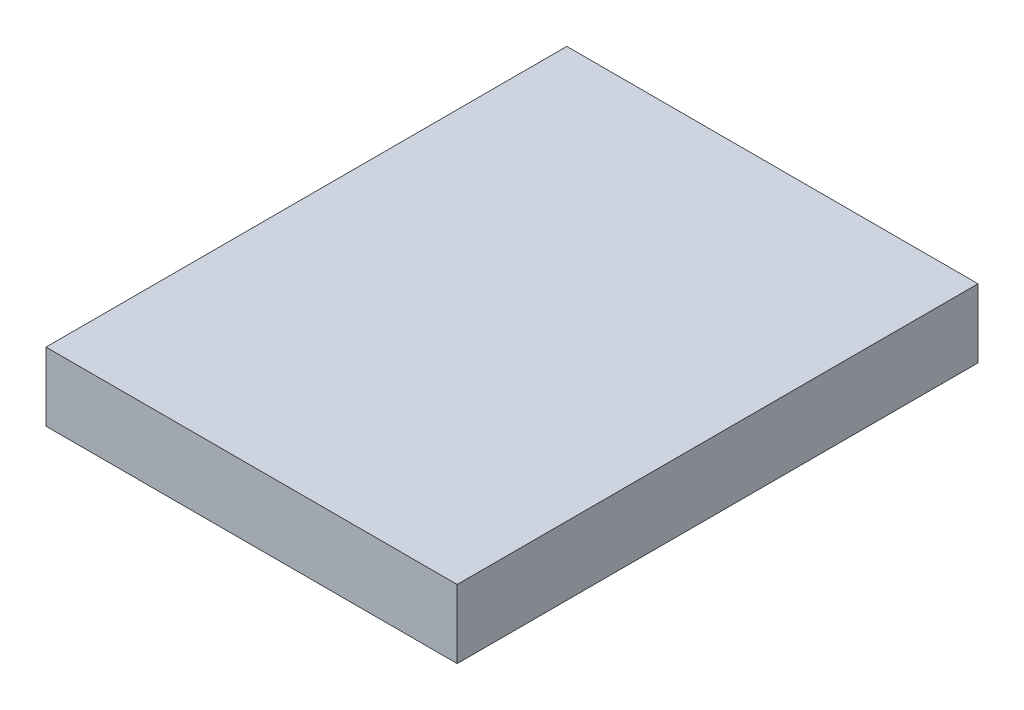
ISO-10303-21;
HEADER;
FILE_DESCRIPTION(('STEP AP214'),'2;1');
FILE_NAME('part.step','',(''),(''),'','','');
FILE_SCHEMA(('AUTOMOTIVE_DESIGN { 1 0 10303 214 1 1 1 1 }'));
ENDSEC;
DATA;
#1=APPLICATION_CONTEXT('core data for automotive mechanical design processes');
#2=APPLICATION_PROTOCOL_DEFINITION('international standard','automotive_design',2000,#1);
#3=PRODUCT_CONTEXT('',#1,'mechanical');
#4=PRODUCT('Part','Part','',(#3));
#5=PRODUCT_RELATED_PRODUCT_CATEGORY('part','',(#4));
#6=PRODUCT_DEFINITION_FORMATION('','',#4);
#7=PRODUCT_DEFINITION_CONTEXT('part definition',#1,'design');
#8=PRODUCT_DEFINITION('design','',#6,#7);
#9=PRODUCT_DEFINITION_SHAPE('','',#8);
#10=(LENGTH_UNIT() NAMED_UNIT(*) SI_UNIT(.MILLI.,.METRE.));
#11=(NAMED_UNIT(*) PLANE_ANGLE_UNIT() SI_UNIT($,.RADIAN.));
#12=(NAMED_UNIT(*) SI_UNIT($,.STERADIAN.) SOLID_ANGLE_UNIT());
#13=UNCERTAINTY_MEASURE_WITH_UNIT(LENGTH_MEASURE(1.E-05),#10,'distance_accuracy_value','');
#14=(GEOMETRIC_REPRESENTATION_CONTEXT(3) GLOBAL_UNCERTAINTY_ASSIGNED_CONTEXT((#13)) GLOBAL_UNIT_ASSIGNED_CONTEXT((#10,
#11,#12)) REPRESENTATION_CONTEXT('',''));
#15=CARTESIAN_POINT('',(0.,0.,0.));
#16=DIRECTION('',(0.,0.,1.));
#17=DIRECTION('',(1.,0.,0.));
#18=AXIS2_PLACEMENT_3D('',#15,#16,#17);
#19=CARTESIAN_POINT('',(-60.,20.,76.));
#20=DIRECTION('',(1.,0.,0.));
#21=DIRECTION('',(0.,0.,-1.));
#22=AXIS2_PLACEMENT_3D('',#19,#20,#21);
#23=PLANE('',#22);
#24=DIRECTION('',(0.,0.,1.));
#25=VECTOR('',#24,1.);
#26=CARTESIAN_POINT('',(-60.,0.,76.));
#27=LINE('',#26,#25);
#28=CARTESIAN_POINT('',(-60.,0.,-76.));
#29=VERTEX_POINT('',#28);
#30=CARTESIAN_POINT('',(-60.,0.,76.));
#31=VERTEX_POINT('',#30);
#32=EDGE_CURVE('E96',#29,#31,#27,.T.);
#33=ORIENTED_EDGE('',*,*,#32,.T.);
#34=DIRECTION('',(0.,-1.,0.));
#35=VECTOR('',#34,1.);
#36=CARTESIAN_POINT('',(-60.,20.,76.));
#37=LINE('',#36,#35);
#38=CARTESIAN_POINT('',(-60.,20.,76.));
#39=VERTEX_POINT('',#38);
#40=EDGE_CURVE('E11',#39,#31,#37,.T.);
#41=ORIENTED_EDGE('',*,*,#40,.F.);
#42=DIRECTION('',(0.,0.,1.));
#43=VECTOR('',#42,1.);
#44=CARTESIAN_POINT('',(-60.,20.,76.));
#45=LINE('',#44,#43);
#46=CARTESIAN_POINT('',(-60.,20.,-76.));
#47=VERTEX_POINT('',#46);
#48=EDGE_CURVE('E84',#47,#39,#45,.T.);
#49=ORIENTED_EDGE('',*,*,#48,.F.);
#50=DIRECTION('',(0.,-1.,0.));
#51=VECTOR('',#50,1.);
#52=CARTESIAN_POINT('',(-60.,20.,-76.));
#53=LINE('',#52,#51);
#54=EDGE_CURVE('E92',#47,#29,#53,.T.);
#55=ORIENTED_EDGE('',*,*,#54,.T.);
#56=EDGE_LOOP('',(#33,#41,#49,#55));
#57=FACE_BOUND('',#56,.T.);
#58=ADVANCED_FACE('F33',(#57),#23,.F.);
#59=CARTESIAN_POINT('',(60.,20.,76.));
#60=DIRECTION('',(0.,0.,-1.));
#61=DIRECTION('',(-1.,0.,0.));
#62=AXIS2_PLACEMENT_3D('',#59,#60,#61);
#63=PLANE('',#62);
#64=DIRECTION('',(1.,0.,0.));
#65=VECTOR('',#64,1.);
#66=CARTESIAN_POINT('',(60.,0.,76.));
#67=LINE('',#66,#65);
#68=CARTESIAN_POINT('',(60.,0.,76.));
#69=VERTEX_POINT('',#68);
#70=EDGE_CURVE('E88',#31,#69,#67,.T.);
#71=ORIENTED_EDGE('',*,*,#70,.T.);
#72=DIRECTION('',(0.,-1.,0.));
#73=VECTOR('',#72,1.);
#74=CARTESIAN_POINT('',(60.,20.,76.));
#75=LINE('',#74,#73);
#76=CARTESIAN_POINT('',(60.,20.,76.));
#77=VERTEX_POINT('',#76);
#78=EDGE_CURVE('E41',#77,#69,#75,.T.);
#79=ORIENTED_EDGE('',*,*,#78,.F.);
#80=DIRECTION('',(1.,0.,0.));
#81=VECTOR('',#80,1.);
#82=CARTESIAN_POINT('',(60.,20.,76.));
#83=LINE('',#82,#81);
#84=EDGE_CURVE('E79',#39,#77,#83,.T.);
#85=ORIENTED_EDGE('',*,*,#84,.F.);
#86=ORIENTED_EDGE('',*,*,#40,.T.);
#87=EDGE_LOOP('',(#71,#79,#85,#86));
#88=FACE_BOUND('',#87,.T.);
#89=ADVANCED_FACE('F87',(#88),#63,.F.);
#90=CARTESIAN_POINT('',(60.,20.,76.));
#91=DIRECTION('',(-1.,0.,0.));
#92=DIRECTION('',(0.,0.,1.));
#93=AXIS2_PLACEMENT_3D('',#90,#91,#92);
#94=PLANE('',#93);
#95=DIRECTION('',(0.,0.,-1.));
#96=VECTOR('',#95,1.);
#97=CARTESIAN_POINT('',(60.,0.,76.));
#98=LINE('',#97,#96);
#99=CARTESIAN_POINT('',(60.,0.,-76.));
#100=VERTEX_POINT('',#99);
#101=EDGE_CURVE('E66',#69,#100,#98,.T.);
#102=ORIENTED_EDGE('',*,*,#101,.T.);
#103=DIRECTION('',(0.,-1.,0.));
#104=VECTOR('',#103,1.);
#105=CARTESIAN_POINT('',(60.,20.,-76.));
#106=LINE('',#105,#104);
#107=CARTESIAN_POINT('',(60.,20.,-76.));
#108=VERTEX_POINT('',#107);
#109=EDGE_CURVE('E89',#108,#100,#106,.T.);
#110=ORIENTED_EDGE('',*,*,#109,.F.);
#111=DIRECTION('',(0.,0.,-1.));
#112=VECTOR('',#111,1.);
#113=CARTESIAN_POINT('',(60.,20.,76.));
#114=LINE('',#113,#112);
#115=EDGE_CURVE('E82',#77,#108,#114,.T.);
#116=ORIENTED_EDGE('',*,*,#115,.F.);
#117=ORIENTED_EDGE('',*,*,#78,.T.);
#118=EDGE_LOOP('',(#102,#110,#116,#117));
#119=FACE_BOUND('',#118,.T.);
#120=ADVANCED_FACE('F90',(#119),#94,.F.);
#121=CARTESIAN_POINT('',(60.,20.,-76.));
#122=DIRECTION('',(0.,0.,1.));
#123=DIRECTION('',(1.,0.,0.));
#124=AXIS2_PLACEMENT_3D('',#121,#122,#123);
#125=PLANE('',#124);
#126=DIRECTION('',(-1.,0.,0.));
#127=VECTOR('',#126,1.);
#128=CARTESIAN_POINT('',(60.,0.,-76.));
#129=LINE('',#128,#127);
#130=EDGE_CURVE('E72',#100,#29,#129,.T.);
#131=ORIENTED_EDGE('',*,*,#130,.T.);
#132=ORIENTED_EDGE('',*,*,#54,.F.);
#133=DIRECTION('',(-1.,0.,0.));
#134=VECTOR('',#133,1.);
#135=CARTESIAN_POINT('',(60.,20.,-76.));
#136=LINE('',#135,#134);
#137=EDGE_CURVE('E49',#108,#47,#136,.T.);
#138=ORIENTED_EDGE('',*,*,#137,.F.);
#139=ORIENTED_EDGE('',*,*,#109,.T.);
#140=EDGE_LOOP('',(#131,#132,#138,#139));
#141=FACE_BOUND('',#140,.T.);
#142=ADVANCED_FACE('F103',(#141),#125,.F.);
#143=CARTESIAN_POINT('',(0.,20.,0.));
#144=DIRECTION('',(0.,1.,0.));
#145=DIRECTION('',(0.,0.,1.));
#146=AXIS2_PLACEMENT_3D('',#143,#144,#145);
#147=PLANE('',#146);
#148=ORIENTED_EDGE('',*,*,#48,.T.);
#149=ORIENTED_EDGE('',*,*,#84,.T.);
#150=ORIENTED_EDGE('',*,*,#115,.T.);
#151=ORIENTED_EDGE('',*,*,#137,.T.);
#152=EDGE_LOOP('',(#148,#149,#150,#151));
#153=FACE_BOUND('',#152,.T.);
#154=ADVANCED_FACE('F80',(#153),#147,.T.);
#155=CARTESIAN_POINT('',(0.,0.,0.));
#156=DIRECTION('',(0.,1.,0.));
#157=DIRECTION('',(0.,0.,1.));
#158=AXIS2_PLACEMENT_3D('',#155,#156,#157);
#159=PLANE('',#158);
#160=ORIENTED_EDGE('',*,*,#32,.F.);
#161=ORIENTED_EDGE('',*,*,#130,.F.);
#162=ORIENTED_EDGE('',*,*,#101,.F.);
#163=ORIENTED_EDGE('',*,*,#70,.F.);
#164=EDGE_LOOP('',(#160,#161,#162,#163));
#165=FACE_BOUND('',#164,.T.);
#166=ADVANCED_FACE('F106',(#165),#159,.F.);
#167=CLOSED_SHELL('',(#58,#89,#120,#142,#154,#166));
#168=MANIFOLD_SOLID_BREP('B2',#167);
#169=ADVANCED_BREP_SHAPE_REPRESENTATION('',(#18,#168),#14);
#170=SHAPE_DEFINITION_REPRESENTATION(#9,#169);
ENDSEC;
END-ISO-10303-21;
